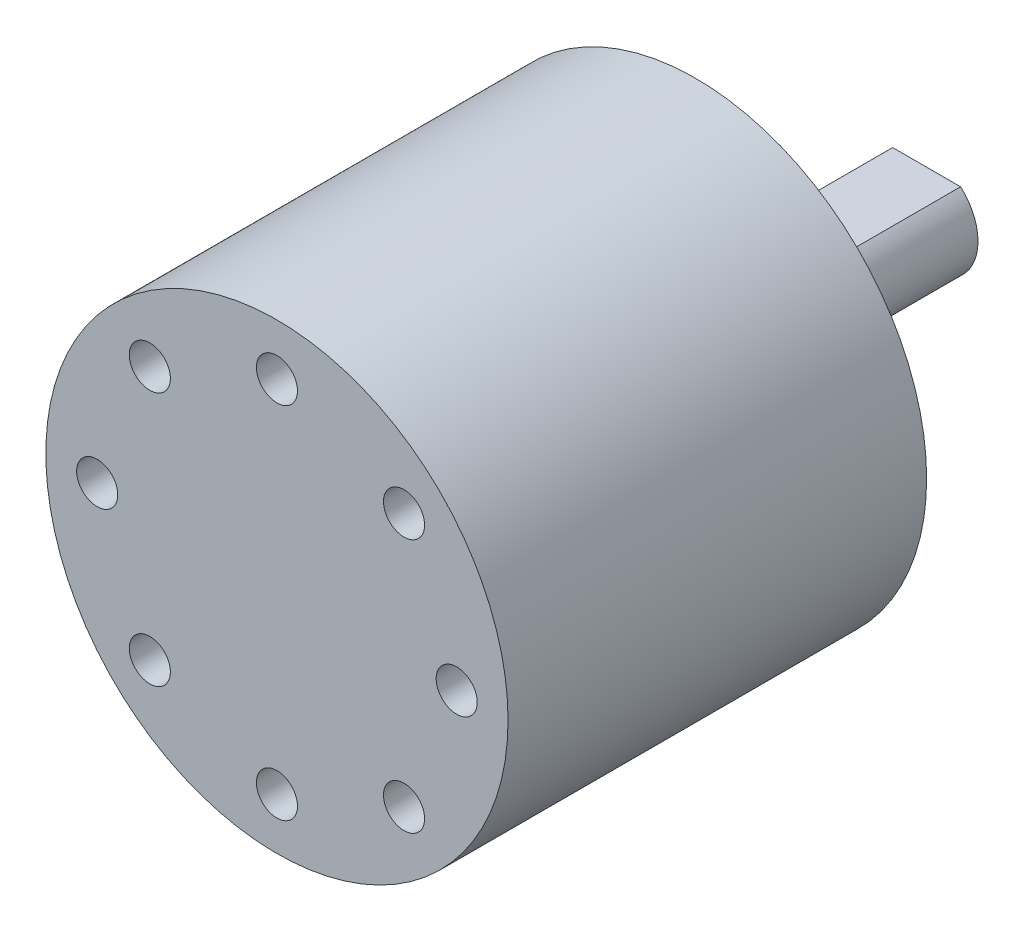
ISO-10303-21;
HEADER;
FILE_DESCRIPTION(('STEP AP214'),'2;1');
FILE_NAME('part.step','',(''),(''),'','','');
FILE_SCHEMA(('AUTOMOTIVE_DESIGN { 1 0 10303 214 1 1 1 1 }'));
ENDSEC;
DATA;
#1=APPLICATION_CONTEXT('core data for automotive mechanical design processes');
#2=APPLICATION_PROTOCOL_DEFINITION('international standard','automotive_design',2000,#1);
#3=PRODUCT_CONTEXT('',#1,'mechanical');
#4=PRODUCT('Part','Part','',(#3));
#5=PRODUCT_RELATED_PRODUCT_CATEGORY('part','',(#4));
#6=PRODUCT_DEFINITION_FORMATION('','',#4);
#7=PRODUCT_DEFINITION_CONTEXT('part definition',#1,'design');
#8=PRODUCT_DEFINITION('design','',#6,#7);
#9=PRODUCT_DEFINITION_SHAPE('','',#8);
#10=(LENGTH_UNIT() NAMED_UNIT(*) SI_UNIT(.MILLI.,.METRE.));
#11=(NAMED_UNIT(*) PLANE_ANGLE_UNIT() SI_UNIT($,.RADIAN.));
#12=(NAMED_UNIT(*) SI_UNIT($,.STERADIAN.) SOLID_ANGLE_UNIT());
#13=UNCERTAINTY_MEASURE_WITH_UNIT(LENGTH_MEASURE(1.E-05),#10,'distance_accuracy_value','');
#14=(GEOMETRIC_REPRESENTATION_CONTEXT(3) GLOBAL_UNCERTAINTY_ASSIGNED_CONTEXT((#13)) GLOBAL_UNIT_ASSIGNED_CONTEXT((#10,
#11,#12)) REPRESENTATION_CONTEXT('',''));
#15=CARTESIAN_POINT('',(0.,0.,0.));
#16=DIRECTION('',(0.,0.,1.));
#17=DIRECTION('',(1.,0.,0.));
#18=AXIS2_PLACEMENT_3D('',#15,#16,#17);
#19=CARTESIAN_POINT('',(0.,0.,32.6));
#20=DIRECTION('',(0.,0.,-1.));
#21=DIRECTION('',(-1.,0.,0.));
#22=AXIS2_PLACEMENT_3D('',#19,#20,#21);
#23=CYLINDRICAL_SURFACE('',#22,18.);
#24=CARTESIAN_POINT('',(0.,0.,32.6));
#25=DIRECTION('',(0.,0.,1.));
#26=DIRECTION('',(1.,0.,0.));
#27=AXIS2_PLACEMENT_3D('',#24,#25,#26);
#28=CIRCLE('',#27,18.);
#29=CARTESIAN_POINT('',(18.,0.,32.6));
#30=VERTEX_POINT('',#29);
#31=EDGE_CURVE('E168',#30,#30,#28,.T.);
#32=ORIENTED_EDGE('',*,*,#31,.F.);
#33=EDGE_LOOP('',(#32));
#34=FACE_BOUND('',#33,.T.);
#35=CARTESIAN_POINT('',(0.,0.,0.));
#36=DIRECTION('',(0.,0.,1.));
#37=DIRECTION('',(1.,0.,0.));
#38=AXIS2_PLACEMENT_3D('',#35,#36,#37);
#39=CIRCLE('',#38,18.);
#40=CARTESIAN_POINT('',(18.,0.,0.));
#41=VERTEX_POINT('',#40);
#42=EDGE_CURVE('E165',#41,#41,#39,.T.);
#43=ORIENTED_EDGE('',*,*,#42,.T.);
#44=EDGE_LOOP('',(#43));
#45=FACE_BOUND('',#44,.T.);
#46=ADVANCED_FACE('F41',(#34,#45),#23,.T.);
#47=CARTESIAN_POINT('',(0.,0.,32.6));
#48=DIRECTION('',(0.,0.,1.));
#49=DIRECTION('',(1.,0.,0.));
#50=AXIS2_PLACEMENT_3D('',#47,#48,#49);
#51=PLANE('',#50);
#52=CARTESIAN_POINT('',(-14.,0.,32.6));
#53=DIRECTION('',(0.,0.,-1.));
#54=DIRECTION('',(0.,-1.,0.));
#55=AXIS2_PLACEMENT_3D('',#52,#53,#54);
#56=CIRCLE('',#55,1.6);
#57=CARTESIAN_POINT('',(-14.,-1.60000000000005,32.6));
#58=VERTEX_POINT('',#57);
#59=EDGE_CURVE('E132',#58,#58,#56,.T.);
#60=ORIENTED_EDGE('',*,*,#59,.T.);
#61=EDGE_LOOP('',(#60));
#62=FACE_BOUND('',#61,.T.);
#63=CARTESIAN_POINT('',(-9.89949493661161,-9.89949493661172,32.6));
#64=DIRECTION('',(0.,0.,-1.));
#65=DIRECTION('',(0.707106781186551,-0.707106781186544,0.));
#66=AXIS2_PLACEMENT_3D('',#63,#64,#65);
#67=CIRCLE('',#66,1.6);
#68=CARTESIAN_POINT('',(-8.76812408671313,-11.0308657865102,32.6));
#69=VERTEX_POINT('',#68);
#70=EDGE_CURVE('E139',#69,#69,#67,.T.);
#71=ORIENTED_EDGE('',*,*,#70,.T.);
#72=EDGE_LOOP('',(#71));
#73=FACE_BOUND('',#72,.T.);
#74=CARTESIAN_POINT('',(0.,-14.,32.6));
#75=DIRECTION('',(0.,0.,-1.));
#76=DIRECTION('',(1.,0.,0.));
#77=AXIS2_PLACEMENT_3D('',#74,#75,#76);
#78=CIRCLE('',#77,1.6);
#79=CARTESIAN_POINT('',(1.6,-14.,32.6));
#80=VERTEX_POINT('',#79);
#81=EDGE_CURVE('E145',#80,#80,#78,.T.);
#82=ORIENTED_EDGE('',*,*,#81,.T.);
#83=EDGE_LOOP('',(#82));
#84=FACE_BOUND('',#83,.T.);
#85=CARTESIAN_POINT('',(9.89949493661175,-9.89949493661158,32.6));
#86=DIRECTION('',(0.,0.,-1.));
#87=DIRECTION('',(0.707106781186541,0.707106781186554,0.));
#88=AXIS2_PLACEMENT_3D('',#85,#86,#87);
#89=CIRCLE('',#88,1.6);
#90=CARTESIAN_POINT('',(11.0308657865102,-8.76812408671309,32.6));
#91=VERTEX_POINT('',#90);
#92=EDGE_CURVE('E151',#91,#91,#89,.T.);
#93=ORIENTED_EDGE('',*,*,#92,.T.);
#94=EDGE_LOOP('',(#93));
#95=FACE_BOUND('',#94,.T.);
#96=CARTESIAN_POINT('',(14.,1.46642216231412E-13,32.6));
#97=DIRECTION('',(0.,0.,-1.));
#98=DIRECTION('',(0.,1.,0.));
#99=AXIS2_PLACEMENT_3D('',#96,#97,#98);
#100=CIRCLE('',#99,1.6);
#101=CARTESIAN_POINT('',(14.,1.60000000000015,32.6));
#102=VERTEX_POINT('',#101);
#103=EDGE_CURVE('E120',#102,#102,#100,.T.);
#104=ORIENTED_EDGE('',*,*,#103,.T.);
#105=EDGE_LOOP('',(#104));
#106=FACE_BOUND('',#105,.T.);
#107=CARTESIAN_POINT('',(9.89949493661154,9.89949493661179,32.6));
#108=DIRECTION('',(0.,0.,-1.));
#109=DIRECTION('',(-0.707106781186556,0.707106781186539,0.));
#110=AXIS2_PLACEMENT_3D('',#107,#108,#109);
#111=CIRCLE('',#110,1.6);
#112=CARTESIAN_POINT('',(8.76812408671305,11.0308657865102,32.6));
#113=VERTEX_POINT('',#112);
#114=EDGE_CURVE('E127',#113,#113,#111,.T.);
#115=ORIENTED_EDGE('',*,*,#114,.T.);
#116=EDGE_LOOP('',(#115));
#117=FACE_BOUND('',#116,.T.);
#118=CARTESIAN_POINT('',(-9.89949493661168,9.89949493661165,32.6));
#119=DIRECTION('',(0.,0.,-1.));
#120=DIRECTION('',(-0.707106781186546,-0.707106781186549,0.));
#121=AXIS2_PLACEMENT_3D('',#118,#119,#120);
#122=CIRCLE('',#121,1.6);
#123=CARTESIAN_POINT('',(-11.0308657865102,8.76812408671317,32.6));
#124=VERTEX_POINT('',#123);
#125=EDGE_CURVE('E156',#124,#124,#122,.T.);
#126=ORIENTED_EDGE('',*,*,#125,.T.);
#127=EDGE_LOOP('',(#126));
#128=FACE_BOUND('',#127,.T.);
#129=CARTESIAN_POINT('',(0.,14.,32.6));
#130=DIRECTION('',(0.,0.,-1.));
#131=DIRECTION('',(-1.,0.,0.));
#132=AXIS2_PLACEMENT_3D('',#129,#130,#131);
#133=CIRCLE('',#132,1.6);
#134=CARTESIAN_POINT('',(-1.6,14.,32.6));
#135=VERTEX_POINT('',#134);
#136=EDGE_CURVE('E162',#135,#135,#133,.T.);
#137=ORIENTED_EDGE('',*,*,#136,.T.);
#138=EDGE_LOOP('',(#137));
#139=FACE_BOUND('',#138,.T.);
#140=ORIENTED_EDGE('',*,*,#31,.T.);
#141=EDGE_LOOP('',(#140));
#142=FACE_BOUND('',#141,.T.);
#143=ADVANCED_FACE('F177',(#62,#73,#84,#95,#106,#117,#128,#139,#142),#51,.T.);
#144=CARTESIAN_POINT('',(0.,0.,0.));
#145=DIRECTION('',(0.,0.,1.));
#146=DIRECTION('',(1.,0.,0.));
#147=AXIS2_PLACEMENT_3D('',#144,#145,#146);
#148=PLANE('',#147);
#149=CARTESIAN_POINT('',(0.,0.,0.));
#150=DIRECTION('',(0.,0.,1.));
#151=DIRECTION('',(1.,0.,0.));
#152=AXIS2_PLACEMENT_3D('',#149,#150,#151);
#153=CIRCLE('',#152,11.);
#154=CARTESIAN_POINT('',(11.,0.,0.));
#155=VERTEX_POINT('',#154);
#156=EDGE_CURVE('E44',#155,#155,#153,.F.);
#157=ORIENTED_EDGE('',*,*,#156,.F.);
#158=EDGE_LOOP('',(#157));
#159=FACE_BOUND('',#158,.T.);
#160=CARTESIAN_POINT('',(-14.,0.,0.));
#161=DIRECTION('',(0.,0.,-1.));
#162=DIRECTION('',(0.,-1.,0.));
#163=AXIS2_PLACEMENT_3D('',#160,#161,#162);
#164=CIRCLE('',#163,1.6);
#165=CARTESIAN_POINT('',(-14.,-1.60000000000005,0.));
#166=VERTEX_POINT('',#165);
#167=EDGE_CURVE('E136',#166,#166,#164,.T.);
#168=ORIENTED_EDGE('',*,*,#167,.F.);
#169=EDGE_LOOP('',(#168));
#170=FACE_BOUND('',#169,.T.);
#171=CARTESIAN_POINT('',(-9.89949493661161,-9.89949493661172,0.));
#172=DIRECTION('',(0.,0.,-1.));
#173=DIRECTION('',(0.707106781186551,-0.707106781186544,0.));
#174=AXIS2_PLACEMENT_3D('',#171,#172,#173);
#175=CIRCLE('',#174,1.6);
#176=CARTESIAN_POINT('',(-8.76812408671313,-11.0308657865102,0.));
#177=VERTEX_POINT('',#176);
#178=EDGE_CURVE('E142',#177,#177,#175,.T.);
#179=ORIENTED_EDGE('',*,*,#178,.F.);
#180=EDGE_LOOP('',(#179));
#181=FACE_BOUND('',#180,.T.);
#182=CARTESIAN_POINT('',(0.,-14.,0.));
#183=DIRECTION('',(0.,0.,-1.));
#184=DIRECTION('',(1.,0.,0.));
#185=AXIS2_PLACEMENT_3D('',#182,#183,#184);
#186=CIRCLE('',#185,1.6);
#187=CARTESIAN_POINT('',(1.6,-14.,0.));
#188=VERTEX_POINT('',#187);
#189=EDGE_CURVE('E148',#188,#188,#186,.T.);
#190=ORIENTED_EDGE('',*,*,#189,.F.);
#191=EDGE_LOOP('',(#190));
#192=FACE_BOUND('',#191,.T.);
#193=CARTESIAN_POINT('',(9.89949493661175,-9.89949493661158,0.));
#194=DIRECTION('',(0.,0.,-1.));
#195=DIRECTION('',(0.707106781186541,0.707106781186554,0.));
#196=AXIS2_PLACEMENT_3D('',#193,#194,#195);
#197=CIRCLE('',#196,1.6);
#198=CARTESIAN_POINT('',(11.0308657865102,-8.76812408671309,0.));
#199=VERTEX_POINT('',#198);
#200=EDGE_CURVE('E123',#199,#199,#197,.T.);
#201=ORIENTED_EDGE('',*,*,#200,.F.);
#202=EDGE_LOOP('',(#201));
#203=FACE_BOUND('',#202,.T.);
#204=CARTESIAN_POINT('',(14.,1.46642216231412E-13,0.));
#205=DIRECTION('',(0.,0.,-1.));
#206=DIRECTION('',(0.,1.,0.));
#207=AXIS2_PLACEMENT_3D('',#204,#205,#206);
#208=CIRCLE('',#207,1.6);
#209=CARTESIAN_POINT('',(14.,1.60000000000015,0.));
#210=VERTEX_POINT('',#209);
#211=EDGE_CURVE('E124',#210,#210,#208,.T.);
#212=ORIENTED_EDGE('',*,*,#211,.F.);
#213=EDGE_LOOP('',(#212));
#214=FACE_BOUND('',#213,.T.);
#215=CARTESIAN_POINT('',(9.89949493661154,9.89949493661179,0.));
#216=DIRECTION('',(0.,0.,-1.));
#217=DIRECTION('',(-0.707106781186556,0.707106781186539,0.));
#218=AXIS2_PLACEMENT_3D('',#215,#216,#217);
#219=CIRCLE('',#218,1.6);
#220=CARTESIAN_POINT('',(8.76812408671305,11.0308657865102,0.));
#221=VERTEX_POINT('',#220);
#222=EDGE_CURVE('E119',#221,#221,#219,.T.);
#223=ORIENTED_EDGE('',*,*,#222,.F.);
#224=EDGE_LOOP('',(#223));
#225=FACE_BOUND('',#224,.T.);
#226=CARTESIAN_POINT('',(-9.89949493661168,9.89949493661165,0.));
#227=DIRECTION('',(0.,0.,-1.));
#228=DIRECTION('',(-0.707106781186546,-0.707106781186549,0.));
#229=AXIS2_PLACEMENT_3D('',#226,#227,#228);
#230=CIRCLE('',#229,1.6);
#231=CARTESIAN_POINT('',(-11.0308657865102,8.76812408671317,0.));
#232=VERTEX_POINT('',#231);
#233=EDGE_CURVE('E135',#232,#232,#230,.T.);
#234=ORIENTED_EDGE('',*,*,#233,.F.);
#235=EDGE_LOOP('',(#234));
#236=FACE_BOUND('',#235,.T.);
#237=CARTESIAN_POINT('',(0.,14.,0.));
#238=DIRECTION('',(0.,0.,-1.));
#239=DIRECTION('',(-1.,0.,0.));
#240=AXIS2_PLACEMENT_3D('',#237,#238,#239);
#241=CIRCLE('',#240,1.6);
#242=CARTESIAN_POINT('',(-1.6,14.,0.));
#243=VERTEX_POINT('',#242);
#244=EDGE_CURVE('E159',#243,#243,#241,.T.);
#245=ORIENTED_EDGE('',*,*,#244,.F.);
#246=EDGE_LOOP('',(#245));
#247=FACE_BOUND('',#246,.T.);
#248=ORIENTED_EDGE('',*,*,#42,.F.);
#249=EDGE_LOOP('',(#248));
#250=FACE_BOUND('',#249,.T.);
#251=ADVANCED_FACE('F174',(#159,#170,#181,#192,#203,#214,#225,#236,#247,#250),#148,.F.);
#252=CARTESIAN_POINT('',(0.,14.,32.6));
#253=DIRECTION('',(0.,0.,-1.));
#254=DIRECTION('',(-1.,0.,0.));
#255=AXIS2_PLACEMENT_3D('',#252,#253,#254);
#256=CYLINDRICAL_SURFACE('',#255,1.6);
#257=ORIENTED_EDGE('',*,*,#136,.F.);
#258=EDGE_LOOP('',(#257));
#259=FACE_BOUND('',#258,.T.);
#260=ORIENTED_EDGE('',*,*,#244,.T.);
#261=EDGE_LOOP('',(#260));
#262=FACE_BOUND('',#261,.T.);
#263=ADVANCED_FACE('F176',(#259,#262),#256,.F.);
#264=CARTESIAN_POINT('',(-9.89949493661168,9.89949493661165,32.6));
#265=DIRECTION('',(0.,0.,-1.));
#266=DIRECTION('',(-1.,0.,0.));
#267=AXIS2_PLACEMENT_3D('',#264,#265,#266);
#268=CYLINDRICAL_SURFACE('',#267,1.6);
#269=ORIENTED_EDGE('',*,*,#125,.F.);
#270=EDGE_LOOP('',(#269));
#271=FACE_BOUND('',#270,.T.);
#272=ORIENTED_EDGE('',*,*,#233,.T.);
#273=EDGE_LOOP('',(#272));
#274=FACE_BOUND('',#273,.T.);
#275=ADVANCED_FACE('F184',(#271,#274),#268,.F.);
#276=CARTESIAN_POINT('',(9.89949493661154,9.89949493661179,32.6));
#277=DIRECTION('',(0.,0.,-1.));
#278=DIRECTION('',(-1.,0.,0.));
#279=AXIS2_PLACEMENT_3D('',#276,#277,#278);
#280=CYLINDRICAL_SURFACE('',#279,1.6);
#281=ORIENTED_EDGE('',*,*,#114,.F.);
#282=EDGE_LOOP('',(#281));
#283=FACE_BOUND('',#282,.T.);
#284=ORIENTED_EDGE('',*,*,#222,.T.);
#285=EDGE_LOOP('',(#284));
#286=FACE_BOUND('',#285,.T.);
#287=ADVANCED_FACE('F215',(#283,#286),#280,.F.);
#288=CARTESIAN_POINT('',(14.,1.46642216231412E-13,32.6));
#289=DIRECTION('',(0.,0.,-1.));
#290=DIRECTION('',(-1.,0.,0.));
#291=AXIS2_PLACEMENT_3D('',#288,#289,#290);
#292=CYLINDRICAL_SURFACE('',#291,1.6);
#293=ORIENTED_EDGE('',*,*,#103,.F.);
#294=EDGE_LOOP('',(#293));
#295=FACE_BOUND('',#294,.T.);
#296=ORIENTED_EDGE('',*,*,#211,.T.);
#297=EDGE_LOOP('',(#296));
#298=FACE_BOUND('',#297,.T.);
#299=ADVANCED_FACE('F224',(#295,#298),#292,.F.);
#300=CARTESIAN_POINT('',(9.89949493661175,-9.89949493661158,32.6));
#301=DIRECTION('',(0.,0.,-1.));
#302=DIRECTION('',(-1.,0.,0.));
#303=AXIS2_PLACEMENT_3D('',#300,#301,#302);
#304=CYLINDRICAL_SURFACE('',#303,1.6);
#305=ORIENTED_EDGE('',*,*,#92,.F.);
#306=EDGE_LOOP('',(#305));
#307=FACE_BOUND('',#306,.T.);
#308=ORIENTED_EDGE('',*,*,#200,.T.);
#309=EDGE_LOOP('',(#308));
#310=FACE_BOUND('',#309,.T.);
#311=ADVANCED_FACE('F233',(#307,#310),#304,.F.);
#312=CARTESIAN_POINT('',(0.,-14.,32.6));
#313=DIRECTION('',(0.,0.,-1.));
#314=DIRECTION('',(-1.,0.,0.));
#315=AXIS2_PLACEMENT_3D('',#312,#313,#314);
#316=CYLINDRICAL_SURFACE('',#315,1.6);
#317=ORIENTED_EDGE('',*,*,#81,.F.);
#318=EDGE_LOOP('',(#317));
#319=FACE_BOUND('',#318,.T.);
#320=ORIENTED_EDGE('',*,*,#189,.T.);
#321=EDGE_LOOP('',(#320));
#322=FACE_BOUND('',#321,.T.);
#323=ADVANCED_FACE('F242',(#319,#322),#316,.F.);
#324=CARTESIAN_POINT('',(-9.89949493661161,-9.89949493661172,32.6));
#325=DIRECTION('',(0.,0.,-1.));
#326=DIRECTION('',(-1.,0.,0.));
#327=AXIS2_PLACEMENT_3D('',#324,#325,#326);
#328=CYLINDRICAL_SURFACE('',#327,1.6);
#329=ORIENTED_EDGE('',*,*,#70,.F.);
#330=EDGE_LOOP('',(#329));
#331=FACE_BOUND('',#330,.T.);
#332=ORIENTED_EDGE('',*,*,#178,.T.);
#333=EDGE_LOOP('',(#332));
#334=FACE_BOUND('',#333,.T.);
#335=ADVANCED_FACE('F251',(#331,#334),#328,.F.);
#336=CARTESIAN_POINT('',(-14.,0.,32.6));
#337=DIRECTION('',(0.,0.,-1.));
#338=DIRECTION('',(-1.,0.,0.));
#339=AXIS2_PLACEMENT_3D('',#336,#337,#338);
#340=CYLINDRICAL_SURFACE('',#339,1.6);
#341=ORIENTED_EDGE('',*,*,#59,.F.);
#342=EDGE_LOOP('',(#341));
#343=FACE_BOUND('',#342,.T.);
#344=ORIENTED_EDGE('',*,*,#167,.T.);
#345=EDGE_LOOP('',(#344));
#346=FACE_BOUND('',#345,.T.);
#347=ADVANCED_FACE('F259',(#343,#346),#340,.F.);
#348=CARTESIAN_POINT('',(0.,0.,-2.));
#349=DIRECTION('',(0.,0.,1.));
#350=DIRECTION('',(1.,0.,0.));
#351=AXIS2_PLACEMENT_3D('',#348,#349,#350);
#352=CYLINDRICAL_SURFACE('',#351,11.);
#353=CARTESIAN_POINT('',(0.,0.,-2.));
#354=DIRECTION('',(0.,0.,-1.));
#355=DIRECTION('',(-1.,0.,0.));
#356=AXIS2_PLACEMENT_3D('',#353,#354,#355);
#357=CIRCLE('',#356,11.);
#358=CARTESIAN_POINT('',(-11.,0.,-2.));
#359=VERTEX_POINT('',#358);
#360=EDGE_CURVE('E116',#359,#359,#357,.T.);
#361=ORIENTED_EDGE('',*,*,#360,.F.);
#362=EDGE_LOOP('',(#361));
#363=FACE_BOUND('',#362,.T.);
#364=ORIENTED_EDGE('',*,*,#156,.T.);
#365=EDGE_LOOP('',(#364));
#366=FACE_BOUND('',#365,.T.);
#367=ADVANCED_FACE('F267',(#363,#366),#352,.T.);
#368=CARTESIAN_POINT('',(0.,0.,-2.));
#369=DIRECTION('',(0.,0.,-1.));
#370=DIRECTION('',(-1.,0.,0.));
#371=AXIS2_PLACEMENT_3D('',#368,#369,#370);
#372=PLANE('',#371);
#373=CARTESIAN_POINT('',(0.,0.,-2.));
#374=DIRECTION('',(0.,0.,-1.));
#375=DIRECTION('',(-1.,0.,0.));
#376=AXIS2_PLACEMENT_3D('',#373,#374,#375);
#377=CIRCLE('',#376,4.);
#378=CARTESIAN_POINT('',(-4.,0.,-2.));
#379=VERTEX_POINT('',#378);
#380=EDGE_CURVE('E11',#379,#379,#377,.T.);
#381=ORIENTED_EDGE('',*,*,#380,.F.);
#382=EDGE_LOOP('',(#381));
#383=FACE_BOUND('',#382,.T.);
#384=ORIENTED_EDGE('',*,*,#360,.T.);
#385=EDGE_LOOP('',(#384));
#386=FACE_BOUND('',#385,.T.);
#387=ADVANCED_FACE('F279',(#383,#386),#372,.T.);
#388=CARTESIAN_POINT('',(0.,0.,-18.));
#389=DIRECTION('',(0.,0.,1.));
#390=DIRECTION('',(1.,0.,0.));
#391=AXIS2_PLACEMENT_3D('',#388,#389,#390);
#392=CYLINDRICAL_SURFACE('',#391,4.);
#393=CARTESIAN_POINT('',(0.,0.,-18.));
#394=DIRECTION('',(0.,0.,-1.));
#395=DIRECTION('',(-1.,0.,0.));
#396=AXIS2_PLACEMENT_3D('',#393,#394,#395);
#397=CIRCLE('',#396,4.);
#398=CARTESIAN_POINT('',(-2.64575131106458,-3.00000000000001,-18.));
#399=VERTEX_POINT('',#398);
#400=CARTESIAN_POINT('',(-2.6457513110646,2.99999999999999,-18.));
#401=VERTEX_POINT('',#400);
#402=EDGE_CURVE('E99',#399,#401,#397,.T.);
#403=ORIENTED_EDGE('',*,*,#402,.F.);
#404=DIRECTION('',(0.,0.,-1.));
#405=VECTOR('',#404,1.);
#406=CARTESIAN_POINT('',(-2.64575131106458,-3.00000000000001,-3.));
#407=LINE('',#406,#405);
#408=CARTESIAN_POINT('',(-2.64575131106458,-3.00000000000001,-3.));
#409=VERTEX_POINT('',#408);
#410=EDGE_CURVE('E56',#409,#399,#407,.T.);
#411=ORIENTED_EDGE('',*,*,#410,.F.);
#412=CARTESIAN_POINT('',(0.,0.,-3.));
#413=DIRECTION('',(0.,0.,-1.));
#414=DIRECTION('',(-1.,0.,0.));
#415=AXIS2_PLACEMENT_3D('',#412,#413,#414);
#416=CIRCLE('',#415,4.);
#417=CARTESIAN_POINT('',(2.64575131106458,-3.00000000000001,-3.));
#418=VERTEX_POINT('',#417);
#419=EDGE_CURVE('E84',#418,#409,#416,.T.);
#420=ORIENTED_EDGE('',*,*,#419,.F.);
#421=DIRECTION('',(0.,0.,-1.));
#422=VECTOR('',#421,1.);
#423=CARTESIAN_POINT('',(2.64575131106458,-3.00000000000001,-3.));
#424=LINE('',#423,#422);
#425=CARTESIAN_POINT('',(2.64575131106458,-3.00000000000001,-18.));
#426=VERTEX_POINT('',#425);
#427=EDGE_CURVE('E92',#418,#426,#424,.T.);
#428=ORIENTED_EDGE('',*,*,#427,.T.);
#429=CARTESIAN_POINT('',(2.6457513110646,2.99999999999999,-18.));
#430=VERTEX_POINT('',#429);
#431=EDGE_CURVE('E114',#430,#426,#397,.T.);
#432=ORIENTED_EDGE('',*,*,#431,.F.);
#433=DIRECTION('',(0.,0.,-1.));
#434=VECTOR('',#433,1.);
#435=CARTESIAN_POINT('',(2.6457513110646,2.99999999999999,-3.));
#436=LINE('',#435,#434);
#437=CARTESIAN_POINT('',(2.6457513110646,2.99999999999999,-3.));
#438=VERTEX_POINT('',#437);
#439=EDGE_CURVE('E64',#438,#430,#436,.T.);
#440=ORIENTED_EDGE('',*,*,#439,.F.);
#441=CARTESIAN_POINT('',(0.,0.,-3.));
#442=DIRECTION('',(0.,0.,-1.));
#443=DIRECTION('',(-1.,0.,0.));
#444=AXIS2_PLACEMENT_3D('',#441,#442,#443);
#445=CIRCLE('',#444,4.);
#446=CARTESIAN_POINT('',(-2.6457513110646,2.99999999999999,-3.));
#447=VERTEX_POINT('',#446);
#448=EDGE_CURVE('E110',#447,#438,#445,.T.);
#449=ORIENTED_EDGE('',*,*,#448,.F.);
#450=DIRECTION('',(0.,0.,-1.));
#451=VECTOR('',#450,1.);
#452=CARTESIAN_POINT('',(-2.6457513110646,2.99999999999999,-3.));
#453=LINE('',#452,#451);
#454=EDGE_CURVE('E106',#447,#401,#453,.T.);
#455=ORIENTED_EDGE('',*,*,#454,.T.);
#456=EDGE_LOOP('',(#403,#411,#420,#428,#432,#440,#449,#455));
#457=FACE_BOUND('',#456,.T.);
#458=ORIENTED_EDGE('',*,*,#380,.T.);
#459=EDGE_LOOP('',(#458));
#460=FACE_BOUND('',#459,.T.);
#461=ADVANCED_FACE('F95',(#457,#460),#392,.T.);
#462=CARTESIAN_POINT('',(0.,0.,-18.));
#463=DIRECTION('',(0.,0.,-1.));
#464=DIRECTION('',(-1.,0.,0.));
#465=AXIS2_PLACEMENT_3D('',#462,#463,#464);
#466=PLANE('',#465);
#467=DIRECTION('',(1.,0.,0.));
#468=VECTOR('',#467,1.);
#469=CARTESIAN_POINT('',(2.64575131106458,-3.00000000000001,-18.));
#470=LINE('',#469,#468);
#471=EDGE_CURVE('E89',#399,#426,#470,.T.);
#472=ORIENTED_EDGE('',*,*,#471,.F.);
#473=ORIENTED_EDGE('',*,*,#402,.T.);
#474=DIRECTION('',(-1.,0.,0.));
#475=VECTOR('',#474,1.);
#476=CARTESIAN_POINT('',(2.6457513110646,2.99999999999999,-18.));
#477=LINE('',#476,#475);
#478=EDGE_CURVE('E108',#430,#401,#477,.T.);
#479=ORIENTED_EDGE('',*,*,#478,.F.);
#480=ORIENTED_EDGE('',*,*,#431,.T.);
#481=EDGE_LOOP('',(#472,#473,#479,#480));
#482=FACE_BOUND('',#481,.T.);
#483=ADVANCED_FACE('F298',(#482),#466,.T.);
#484=CARTESIAN_POINT('',(2.6457513110646,2.99999999999999,-3.));
#485=DIRECTION('',(0.,-1.,0.));
#486=DIRECTION('',(0.,0.,-1.));
#487=AXIS2_PLACEMENT_3D('',#484,#485,#486);
#488=PLANE('',#487);
#489=ORIENTED_EDGE('',*,*,#478,.T.);
#490=ORIENTED_EDGE('',*,*,#454,.F.);
#491=DIRECTION('',(-1.,0.,0.));
#492=VECTOR('',#491,1.);
#493=CARTESIAN_POINT('',(2.6457513110646,2.99999999999999,-3.));
#494=LINE('',#493,#492);
#495=EDGE_CURVE('E105',#438,#447,#494,.T.);
#496=ORIENTED_EDGE('',*,*,#495,.F.);
#497=ORIENTED_EDGE('',*,*,#439,.T.);
#498=EDGE_LOOP('',(#489,#490,#496,#497));
#499=FACE_BOUND('',#498,.T.);
#500=ADVANCED_FACE('F307',(#499),#488,.F.);
#501=CARTESIAN_POINT('',(0.,0.,-3.));
#502=DIRECTION('',(0.,0.,-1.));
#503=DIRECTION('',(-1.,0.,0.));
#504=AXIS2_PLACEMENT_3D('',#501,#502,#503);
#505=PLANE('',#504);
#506=ORIENTED_EDGE('',*,*,#448,.T.);
#507=ORIENTED_EDGE('',*,*,#495,.T.);
#508=EDGE_LOOP('',(#506,#507));
#509=FACE_BOUND('',#508,.T.);
#510=ADVANCED_FACE('F317',(#509),#505,.T.);
#511=CARTESIAN_POINT('',(2.64575131106458,-3.00000000000001,-3.));
#512=DIRECTION('',(0.,1.,0.));
#513=DIRECTION('',(-1.,0.,0.));
#514=AXIS2_PLACEMENT_3D('',#511,#512,#513);
#515=PLANE('',#514);
#516=ORIENTED_EDGE('',*,*,#471,.T.);
#517=ORIENTED_EDGE('',*,*,#427,.F.);
#518=DIRECTION('',(1.,0.,0.));
#519=VECTOR('',#518,1.);
#520=CARTESIAN_POINT('',(2.64575131106458,-3.00000000000001,-3.));
#521=LINE('',#520,#519);
#522=EDGE_CURVE('E86',#409,#418,#521,.T.);
#523=ORIENTED_EDGE('',*,*,#522,.F.);
#524=ORIENTED_EDGE('',*,*,#410,.T.);
#525=EDGE_LOOP('',(#516,#517,#523,#524));
#526=FACE_BOUND('',#525,.T.);
#527=ADVANCED_FACE('F91',(#526),#515,.F.);
#528=CARTESIAN_POINT('',(0.,0.,-3.));
#529=DIRECTION('',(0.,0.,-1.));
#530=DIRECTION('',(-1.,0.,0.));
#531=AXIS2_PLACEMENT_3D('',#528,#529,#530);
#532=PLANE('',#531);
#533=ORIENTED_EDGE('',*,*,#419,.T.);
#534=ORIENTED_EDGE('',*,*,#522,.T.);
#535=EDGE_LOOP('',(#533,#534));
#536=FACE_BOUND('',#535,.T.);
#537=ADVANCED_FACE('F85',(#536),#532,.T.);
#538=CLOSED_SHELL('',(#46,#143,#251,#263,#275,#287,#299,#311,#323,#335,#347,#367,#387,#461,#483,
#500,#510,#527,#537));
#539=MANIFOLD_SOLID_BREP('B2',#538);
#540=ADVANCED_BREP_SHAPE_REPRESENTATION('',(#18,#539),#14);
#541=SHAPE_DEFINITION_REPRESENTATION(#9,#540);
ENDSEC;
END-ISO-10303-21;
